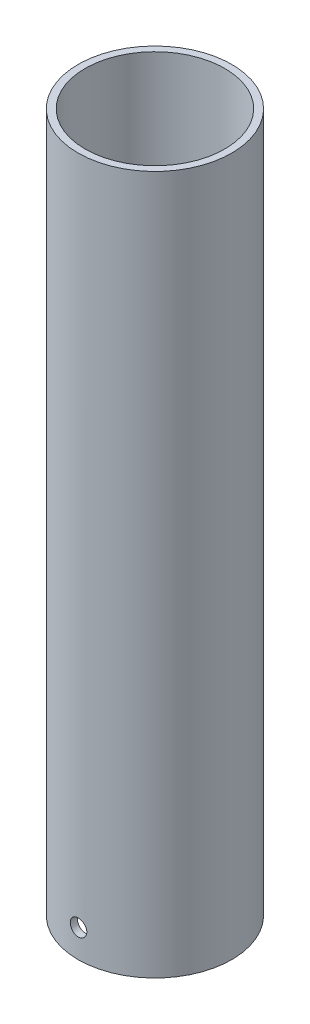
ISO-10303-21;
HEADER;
FILE_DESCRIPTION(('STEP AP214'),'2;1');
FILE_NAME('part.step','',(''),(''),'','','');
FILE_SCHEMA(('AUTOMOTIVE_DESIGN { 1 0 10303 214 1 1 1 1 }'));
ENDSEC;
DATA;
#1=APPLICATION_CONTEXT('core data for automotive mechanical design processes');
#2=APPLICATION_PROTOCOL_DEFINITION('international standard','automotive_design',2000,#1);
#3=PRODUCT_CONTEXT('',#1,'mechanical');
#4=PRODUCT('Part','Part','',(#3));
#5=PRODUCT_RELATED_PRODUCT_CATEGORY('part','',(#4));
#6=PRODUCT_DEFINITION_FORMATION('','',#4);
#7=PRODUCT_DEFINITION_CONTEXT('part definition',#1,'design');
#8=PRODUCT_DEFINITION('design','',#6,#7);
#9=PRODUCT_DEFINITION_SHAPE('','',#8);
#10=(LENGTH_UNIT() NAMED_UNIT(*) SI_UNIT(.MILLI.,.METRE.));
#11=(NAMED_UNIT(*) PLANE_ANGLE_UNIT() SI_UNIT($,.RADIAN.));
#12=(NAMED_UNIT(*) SI_UNIT($,.STERADIAN.) SOLID_ANGLE_UNIT());
#13=UNCERTAINTY_MEASURE_WITH_UNIT(LENGTH_MEASURE(1.E-05),#10,'distance_accuracy_value','');
#14=(GEOMETRIC_REPRESENTATION_CONTEXT(3) GLOBAL_UNCERTAINTY_ASSIGNED_CONTEXT((#13)) GLOBAL_UNIT_ASSIGNED_CONTEXT((#10,
#11,#12)) REPRESENTATION_CONTEXT('',''));
#15=CARTESIAN_POINT('',(0.,0.,0.));
#16=DIRECTION('',(0.,0.,1.));
#17=DIRECTION('',(1.,0.,0.));
#18=AXIS2_PLACEMENT_3D('',#15,#16,#17);
#19=CARTESIAN_POINT('',(0.,-500.,0.));
#20=DIRECTION('',(0.,1.,0.));
#21=DIRECTION('',(0.,0.,1.));
#22=AXIS2_PLACEMENT_3D('',#19,#20,#21);
#23=CYLINDRICAL_SURFACE('',#22,55.);
#24=CARTESIAN_POINT('',(0.,-485.9,55.));
#25=CARTESIAN_POINT('',(0.165251923815972,-485.900001696065,55.0000004926408));
#26=CARTESIAN_POINT('',(0.33047823093432,-485.893054655717,54.9992537367276));
#27=CARTESIAN_POINT('',(0.659804479086756,-485.865318537519,54.9962886281673));
#28=CARTESIAN_POINT('',(0.823904144690006,-485.84452618867,54.9940699277689));
#29=CARTESIAN_POINT('',(1.14987884905884,-485.789225601533,54.9882203773107));
#30=CARTESIAN_POINT('',(1.31175204257843,-485.754706621258,54.984588421334));
#31=CARTESIAN_POINT('',(1.63205457948574,-485.672191583186,54.9760136258339));
#32=CARTESIAN_POINT('',(1.79048263931581,-485.624190592022,54.9710703064905));
#33=CARTESIAN_POINT('',(2.1025546966715,-485.51512089148,54.9600183823701));
#34=CARTESIAN_POINT('',(2.25620329863431,-485.45406523537,54.9539109422467));
#35=CARTESIAN_POINT('',(2.55785693090068,-485.319273342346,54.9406968604664));
#36=CARTESIAN_POINT('',(2.70585985845128,-485.245532436029,54.9335898510474));
#37=CARTESIAN_POINT('',(2.99504401897061,-485.085958017382,54.9185821574634));
#38=CARTESIAN_POINT('',(3.13622906430226,-485.000131370705,54.9106819246382));
#39=CARTESIAN_POINT('',(3.41093470357817,-484.816927588087,54.8943026917391));
#40=CARTESIAN_POINT('',(3.544452437054,-484.719546182386,54.8858234782125));
#41=CARTESIAN_POINT('',(3.8032645099277,-484.5136036573,54.8684978757714));
#42=CARTESIAN_POINT('',(3.92853031801673,-484.405006774676,54.8596503695649));
#43=CARTESIAN_POINT('',(4.16952380011991,-484.177622164266,54.8418606478602));
#44=CARTESIAN_POINT('',(4.28524793086471,-484.058830683873,54.8329183985583));
#45=CARTESIAN_POINT('',(4.50625929142161,-483.811963479578,54.8151978683042));
#46=CARTESIAN_POINT('',(4.61154985544568,-483.683890744447,54.8064195357025));
#47=CARTESIAN_POINT('',(4.81103154241922,-483.419274733328,54.7892690647472));
#48=CARTESIAN_POINT('',(4.90521855556136,-483.282728349316,54.7808970774664));
#49=CARTESIAN_POINT('',(5.08196459826547,-483.001869709795,54.7647836804045));
#50=CARTESIAN_POINT('',(5.16449891203188,-482.857541818931,54.7570436252048));
#51=CARTESIAN_POINT('',(5.31714060360541,-482.562350529781,54.7424323236239));
#52=CARTESIAN_POINT('',(5.38724336475793,-482.411484729312,54.7355614002791));
#53=CARTESIAN_POINT('',(5.51445125574265,-482.1043822326,54.7228921541646));
#54=CARTESIAN_POINT('',(5.57156146931002,-481.948147664691,54.7170934120378));
#55=CARTESIAN_POINT('',(5.67241823407836,-481.631366333858,54.7067290417786));
#56=CARTESIAN_POINT('',(5.71615986826452,-481.47081800788,54.7021638674284));
#57=CARTESIAN_POINT('',(5.82645693690559,-480.98578475035,54.6905674420412));
#58=CARTESIAN_POINT('',(5.87271957058156,-480.656373580176,54.6855698533077));
#59=CARTESIAN_POINT('',(5.90931015438678,-479.994606873016,54.6816271290788));
#60=CARTESIAN_POINT('',(5.89963978284728,-479.662251424676,54.6826818119783));
#61=CARTESIAN_POINT('',(5.82488663349667,-479.005276148906,54.6906946583063));
#62=CARTESIAN_POINT('',(5.76003569448409,-478.68062978952,54.6976281218599));
#63=CARTESIAN_POINT('',(5.57710373909042,-478.04686819144,54.7165815111996));
#64=CARTESIAN_POINT('',(5.45902190641148,-477.737753191,54.7286015149876));
#65=CARTESIAN_POINT('',(5.17273112909581,-477.143084003696,54.7564012345136));
#66=CARTESIAN_POINT('',(5.00441986719734,-476.857579442024,54.7721886111024));
#67=CARTESIAN_POINT('',(4.62252000107564,-476.318783054902,54.8057381299016));
#68=CARTESIAN_POINT('',(4.40892987105285,-476.065492315447,54.8235003386499));
#69=CARTESIAN_POINT('',(3.94124313108592,-475.596965265478,54.859108177559));
#70=CARTESIAN_POINT('',(3.68694634668255,-475.381928716354,54.8769537733407));
#71=CARTESIAN_POINT('',(3.14575825416079,-474.99756465262,54.9106327193298));
#72=CARTESIAN_POINT('',(2.85886690060961,-474.828237201725,54.9264660667323));
#73=CARTESIAN_POINT('',(2.26049088569065,-474.540103668175,54.954342884671));
#74=CARTESIAN_POINT('',(1.94900099771093,-474.421308356843,54.9663855470505));
#75=CARTESIAN_POINT('',(1.31033803276483,-474.237760945678,54.9853161637654));
#76=CARTESIAN_POINT('',(0.983165496153702,-474.173006985228,54.9922042955675));
#77=CARTESIAN_POINT('',(0.324153679234895,-474.09963528852,55.0000268820587));
#78=CARTESIAN_POINT('',(-0.0076545921820972,-474.090742023393,55.0009905581983));
#79=CARTESIAN_POINT('',(-0.668036806137716,-474.128619575641,54.996934154655));
#80=CARTESIAN_POINT('',(-0.996610799004966,-474.175389525456,54.9919141682328));
#81=CARTESIAN_POINT('',(-1.64039743331984,-474.323037183129,54.9764730521853));
#82=CARTESIAN_POINT('',(-1.95564014468717,-474.423785245751,54.9660648660119));
#83=CARTESIAN_POINT('',(-2.56475193342887,-474.676395697931,54.941014321307));
#84=CARTESIAN_POINT('',(-2.85862046358909,-474.828259395572,54.9263718544185));
#85=CARTESIAN_POINT('',(-3.41788376599179,-475.17946877718,54.8944162354283));
#86=CARTESIAN_POINT('',(-3.68316474263062,-475.378994738182,54.8770930335597));
#87=CARTESIAN_POINT('',(-4.17656899471111,-475.819608464816,54.8417503145396));
#88=CARTESIAN_POINT('',(-4.40469119352489,-476.060697434267,54.8237307772315));
#89=CARTESIAN_POINT('',(-4.81826509203011,-476.578794480963,54.7889376472177));
#90=CARTESIAN_POINT('',(-5.00353546783884,-476.855947708161,54.7721695453092));
#91=CARTESIAN_POINT('',(-5.32489676059165,-477.437609643072,54.7418637464266));
#92=CARTESIAN_POINT('',(-5.46098843674121,-477.742117928396,54.7283259995843));
#93=CARTESIAN_POINT('',(-5.67983450106614,-478.369172203244,54.7060473210284));
#94=CARTESIAN_POINT('',(-5.76269524465273,-478.69168081718,54.6972968296044));
#95=CARTESIAN_POINT('',(-5.87304868084153,-479.346314261344,54.685560435615));
#96=CARTESIAN_POINT('',(-5.9005432232974,-479.678438769919,54.6825743404542));
#97=CARTESIAN_POINT('',(-5.8997163487702,-480.175369647343,54.6826588098542));
#98=CARTESIAN_POINT('',(-5.89248598669608,-480.340471969737,54.6834414198669));
#99=CARTESIAN_POINT('',(-5.86421583754713,-480.669459836055,54.6864811465573));
#100=CARTESIAN_POINT('',(-5.84318118124395,-480.833345809192,54.6887377153933));
#101=CARTESIAN_POINT('',(-5.7874403342461,-481.158799561572,54.6946643313782));
#102=CARTESIAN_POINT('',(-5.75272914303297,-481.320366470482,54.6983348955118));
#103=CARTESIAN_POINT('',(-5.66990757154475,-481.639932584327,54.706982025054));
#104=CARTESIAN_POINT('',(-5.62180208397009,-481.797933069275,54.7119581135393));
#105=CARTESIAN_POINT('',(-5.51252537576239,-482.109336056446,54.7230762768164));
#106=CARTESIAN_POINT('',(-5.45135191868914,-482.262737766508,54.7292185511681));
#107=CARTESIAN_POINT('',(-5.31640908813656,-482.563785091999,54.7424915976431));
#108=CARTESIAN_POINT('',(-5.24264430874209,-482.711432782797,54.7496220090557));
#109=CARTESIAN_POINT('',(-5.08300000902407,-483.000052963189,54.7646741791044));
#110=CARTESIAN_POINT('',(-4.99711616417456,-483.141023045878,54.7725962199271));
#111=CARTESIAN_POINT('',(-4.81389363696643,-483.415201987271,54.7890032877828));
#112=CARTESIAN_POINT('',(-4.71655910689096,-483.548413633325,54.7974881102543));
#113=CARTESIAN_POINT('',(-4.51054996658395,-483.806887781118,54.8148308069172));
#114=CARTESIAN_POINT('',(-4.40181832551174,-483.932104716691,54.8236904106697));
#115=CARTESIAN_POINT('',(-4.17424900525383,-484.172898006421,54.8414866928416));
#116=CARTESIAN_POINT('',(-4.05541502198889,-484.288477855894,54.850423342008));
#117=CARTESIAN_POINT('',(-3.80836367378882,-484.509305082647,54.8681301693788));
#118=CARTESIAN_POINT('',(-3.68014065671115,-484.614546145288,54.8769002432384));
#119=CARTESIAN_POINT('',(-3.41532206337729,-484.813837003028,54.8940176211671));
#120=CARTESIAN_POINT('',(-3.27872959659365,-484.907890916708,54.9023650801688));
#121=CARTESIAN_POINT('',(-2.99763164729147,-485.084470656935,54.918431173152));
#122=CARTESIAN_POINT('',(-2.85310202042774,-485.166958248623,54.9261476879342));
#123=CARTESIAN_POINT('',(-2.557613120907,-485.319421568178,54.9406997304938));
#124=CARTESIAN_POINT('',(-2.40665622923734,-485.389401880297,54.9475355808006));
#125=CARTESIAN_POINT('',(-2.09945502818866,-485.51632878573,54.9601300368283));
#126=CARTESIAN_POINT('',(-1.94321511265078,-485.573285918445,54.9658895129429));
#127=CARTESIAN_POINT('',(-1.62650076165339,-485.673808309576,54.9761730862795));
#128=CARTESIAN_POINT('',(-1.46602736556805,-485.717376822451,54.9806974836903));
#129=CARTESIAN_POINT('',(-1.09030889926869,-485.802515974921,54.989606573991));
#130=CARTESIAN_POINT('',(-0.873888135135636,-485.83903668697,54.9934884237775));
#131=CARTESIAN_POINT('',(-0.438296557663357,-485.887777515191,54.9986848038389));
#132=CARTESIAN_POINT('',(-0.219125757868508,-485.899997751,54.9999993467532));
#133=CARTESIAN_POINT('',(0.,-485.9,55.));
#134=B_SPLINE_CURVE_WITH_KNOTS('',3,(#24,#25,#26,#27,#28,#29,#30,#31,#32,#33,#34,#35,#36,#37,
#38,#39,#40,#41,#42,#43,#44,#45,#46,#47,#48,#49,#50,#51,#52,#53,#54,#55,#56,#57,#58,#59,#60,#61,
#62,#63,#64,#65,#66,#67,#68,#69,#70,#71,#72,#73,#74,#75,#76,#77,#78,#79,#80,#81,#82,#83,#84,#85,
#86,#87,#88,#89,#90,#91,#92,#93,#94,#95,#96,#97,#98,#99,#100,#101,#102,#103,#104,#105,#106,#107,
#108,#109,#110,#111,#112,#113,#114,#115,#116,#117,#118,#119,#120,#121,#122,#123,#124,#125,#126,
#127,#128,#129,#130,#131,#132,#133),.UNSPECIFIED.,.T.,.F.,(4,2,2,2,2,2,2,2,2,2,2,2,2,2,2,2,2,2,
2,2,2,2,2,2,2,2,2,2,2,2,2,2,2,2,2,2,2,2,2,2,2,2,2,2,2,2,2,2,2,2,2,2,2,2,4),(0.,
0.495564114495024,0.991245349171966,1.48731525260215,1.98356691599698,2.47932468206426,
2.97526532712235,3.47092536685804,3.96676913851035,4.46424593211075,4.96190663772064,
5.45940779157145,5.95709251342609,6.45581747465832,6.95472725922807,7.45344149290461,
7.95233893545496,8.94520183164471,9.93803493604739,10.9267171755196,11.9154145769883,
12.9061398621183,13.8968985378483,14.892688033057,15.8884789162896,16.8844819539824,
17.8804506984155,18.8715030156346,19.8625398866268,20.8512070752453,21.8398995664646,
22.8323925973491,23.8249143793324,24.821562085904,25.818194405881,26.8128292097761,
27.8074307811334,28.3027360900402,28.7978574083561,29.2931599249257,29.788281753037,
30.2834883838211,30.778514717628,31.2737181437487,31.7687425479874,32.2663743812832,
32.7638249341023,33.2615774509369,33.7591461478227,34.2583227248082,34.7573159633971,
35.2559039360102,35.754370617569,36.4114969872624,37.0686201217688),.UNSPECIFIED.);
#135=CARTESIAN_POINT('',(0.,-485.9,55.));
#136=VERTEX_POINT('',#135);
#137=EDGE_CURVE('E10',#136,#136,#134,.T.);
#138=ORIENTED_EDGE('',*,*,#137,.F.);
#139=EDGE_LOOP('',(#138));
#140=FACE_BOUND('',#139,.T.);
#141=CARTESIAN_POINT('',(0.,-500.,0.));
#142=DIRECTION('',(0.,1.,0.));
#143=DIRECTION('',(0.,0.,1.));
#144=AXIS2_PLACEMENT_3D('',#141,#142,#143);
#145=CIRCLE('',#144,55.);
#146=CARTESIAN_POINT('',(0.,-500.,55.));
#147=VERTEX_POINT('',#146);
#148=EDGE_CURVE('E44',#147,#147,#145,.T.);
#149=ORIENTED_EDGE('',*,*,#148,.T.);
#150=EDGE_LOOP('',(#149));
#151=FACE_BOUND('',#150,.T.);
#152=CARTESIAN_POINT('',(0.,0.,0.));
#153=DIRECTION('',(0.,1.,0.));
#154=DIRECTION('',(0.,0.,1.));
#155=AXIS2_PLACEMENT_3D('',#152,#153,#154);
#156=CIRCLE('',#155,55.);
#157=CARTESIAN_POINT('',(0.,0.,55.));
#158=VERTEX_POINT('',#157);
#159=EDGE_CURVE('E48',#158,#158,#156,.T.);
#160=ORIENTED_EDGE('',*,*,#159,.F.);
#161=EDGE_LOOP('',(#160));
#162=FACE_BOUND('',#161,.T.);
#163=ADVANCED_FACE('F34',(#140,#151,#162),#23,.T.);
#164=CARTESIAN_POINT('',(0.,-500.,0.));
#165=DIRECTION('',(0.,1.,0.));
#166=DIRECTION('',(0.,0.,1.));
#167=AXIS2_PLACEMENT_3D('',#164,#165,#166);
#168=PLANE('',#167);
#169=CARTESIAN_POINT('',(0.,-500.,0.));
#170=DIRECTION('',(0.,1.,0.));
#171=DIRECTION('',(0.,0.,1.));
#172=AXIS2_PLACEMENT_3D('',#169,#170,#171);
#173=CIRCLE('',#172,50.);
#174=CARTESIAN_POINT('',(0.,-500.,50.));
#175=VERTEX_POINT('',#174);
#176=EDGE_CURVE('E53',#175,#175,#173,.T.);
#177=ORIENTED_EDGE('',*,*,#176,.T.);
#178=EDGE_LOOP('',(#177));
#179=FACE_BOUND('',#178,.T.);
#180=ORIENTED_EDGE('',*,*,#148,.F.);
#181=EDGE_LOOP('',(#180));
#182=FACE_BOUND('',#181,.T.);
#183=ADVANCED_FACE('F79',(#179,#182),#168,.F.);
#184=CARTESIAN_POINT('',(0.,0.,0.));
#185=DIRECTION('',(0.,1.,0.));
#186=DIRECTION('',(0.,0.,1.));
#187=AXIS2_PLACEMENT_3D('',#184,#185,#186);
#188=PLANE('',#187);
#189=CARTESIAN_POINT('',(0.,0.,0.));
#190=DIRECTION('',(0.,1.,0.));
#191=DIRECTION('',(0.,0.,1.));
#192=AXIS2_PLACEMENT_3D('',#189,#190,#191);
#193=CIRCLE('',#192,50.);
#194=CARTESIAN_POINT('',(0.,0.,50.));
#195=VERTEX_POINT('',#194);
#196=EDGE_CURVE('E55',#195,#195,#193,.T.);
#197=ORIENTED_EDGE('',*,*,#196,.F.);
#198=EDGE_LOOP('',(#197));
#199=FACE_BOUND('',#198,.T.);
#200=ORIENTED_EDGE('',*,*,#159,.T.);
#201=EDGE_LOOP('',(#200));
#202=FACE_BOUND('',#201,.T.);
#203=ADVANCED_FACE('F75',(#199,#202),#188,.T.);
#204=CARTESIAN_POINT('',(0.,-500.,0.));
#205=DIRECTION('',(0.,1.,0.));
#206=DIRECTION('',(0.,0.,1.));
#207=AXIS2_PLACEMENT_3D('',#204,#205,#206);
#208=CYLINDRICAL_SURFACE('',#207,50.);
#209=CARTESIAN_POINT('',(0.,-485.9,50.));
#210=CARTESIAN_POINT('',(0.165145285581986,-485.900001811355,50.0000005754628));
#211=CARTESIAN_POINT('',(0.33026366803312,-485.893063676845,49.9991801874426));
#212=CARTESIAN_POINT('',(0.65937331590051,-485.865363881165,49.9959227858171));
#213=CARTESIAN_POINT('',(0.823364312528986,-485.844599031575,49.9934853993351));
#214=CARTESIAN_POINT('',(1.14911724716409,-485.789373485081,49.9870592908841));
#215=CARTESIAN_POINT('',(1.31087739280681,-485.75490237171,49.9830693890861));
#216=CARTESIAN_POINT('',(1.63095444440045,-485.672504396424,49.9736493718119));
#217=CARTESIAN_POINT('',(1.78927006655474,-485.624572607151,49.9682187289843));
#218=CARTESIAN_POINT('',(2.1011151440984,-485.515665403778,49.9560771300883));
#219=CARTESIAN_POINT('',(2.25464934365634,-485.454703423532,49.9493674934006));
#220=CARTESIAN_POINT('',(2.55608026926765,-485.320122820776,49.9348498815033));
#221=CARTESIAN_POINT('',(2.70397489458645,-485.24649953714,49.927041501996));
#222=CARTESIAN_POINT('',(2.99295438840265,-485.087183095532,49.9105516017614));
#223=CARTESIAN_POINT('',(3.13404299199186,-485.00149666127,49.9018705681961));
#224=CARTESIAN_POINT('',(3.40857070519793,-484.818595294166,49.8838709283505));
#225=CARTESIAN_POINT('',(3.54200695734625,-484.721376095917,49.8745520867185));
#226=CARTESIAN_POINT('',(3.80077105305428,-484.515701988143,49.855501615222));
#227=CARTESIAN_POINT('',(3.92606404617252,-484.407203370311,49.8457684729308));
#228=CARTESIAN_POINT('',(4.16712194255103,-484.180016235346,49.8261951906713));
#229=CARTESIAN_POINT('',(4.28288330542807,-484.061323965076,49.8163550124688));
#230=CARTESIAN_POINT('',(4.50398157896774,-483.814652514465,49.7968519713897));
#231=CARTESIAN_POINT('',(4.60932179702516,-483.686676303097,49.7871890530536));
#232=CARTESIAN_POINT('',(4.80891611334244,-483.422247291075,49.7683070015079));
#233=CARTESIAN_POINT('',(4.9031661071188,-483.285791380464,49.7590880333448));
#234=CARTESIAN_POINT('',(5.08009897707705,-483.005028791702,49.7413361785004));
#235=CARTESIAN_POINT('',(5.16275082511973,-482.860702436671,49.7328051572217));
#236=CARTESIAN_POINT('',(5.31562617721763,-482.565494703527,49.716697684174));
#237=CARTESIAN_POINT('',(5.38584506035761,-482.414610914075,49.7091215876186));
#238=CARTESIAN_POINT('',(5.51328045856821,-482.107453099113,49.6951492615471));
#239=CARTESIAN_POINT('',(5.57050211783806,-481.951181234465,49.688752565423));
#240=CARTESIAN_POINT('',(5.67157412574277,-481.634306426872,49.6773167022509));
#241=CARTESIAN_POINT('',(5.71541955995205,-481.473701915643,49.6722780342215));
#242=CARTESIAN_POINT('',(5.82595123920083,-480.988735669625,49.6594813975066));
#243=CARTESIAN_POINT('',(5.87237238922735,-480.659432847521,49.6539588960552));
#244=CARTESIAN_POINT('',(5.90930756979548,-479.997847406108,49.6495758727492));
#245=CARTESIAN_POINT('',(5.89982361234882,-479.665564894467,49.6507151111401));
#246=CARTESIAN_POINT('',(5.82550174562499,-479.009011130839,49.6594895282279));
#247=CARTESIAN_POINT('',(5.76094499968212,-478.684707780041,49.6670917109483));
#248=CARTESIAN_POINT('',(5.57872881083169,-478.051583000024,49.6878870170284));
#249=CARTESIAN_POINT('',(5.4610683994788,-477.742761853267,49.701080242351));
#250=CARTESIAN_POINT('',(5.17568531494602,-477.148474004874,49.7316078940902));
#251=CARTESIAN_POINT('',(5.00783965681982,-476.86306689744,49.7489524728188));
#252=CARTESIAN_POINT('',(4.6269372931981,-476.32436580936,49.7858207132511));
#253=CARTESIAN_POINT('',(4.41387874414613,-476.071073138854,49.8053444637951));
#254=CARTESIAN_POINT('',(3.94703659645635,-475.602156856558,49.8445180305151));
#255=CARTESIAN_POINT('',(3.69301043777887,-475.386774660252,49.8641678830803));
#256=CARTESIAN_POINT('',(3.15228113871992,-475.001670666714,49.901266929179));
#257=CARTESIAN_POINT('',(2.86557793627299,-474.83194895621,49.9187161185326));
#258=CARTESIAN_POINT('',(2.26745256274046,-474.542986436861,49.949456979023));
#259=CARTESIAN_POINT('',(1.95602344360066,-474.423759877342,49.9627474763343));
#260=CARTESIAN_POINT('',(1.31737428003723,-474.239359275451,49.9836625010356));
#261=CARTESIAN_POINT('',(0.990154894585969,-474.174182979468,49.9912872646551));
#262=CARTESIAN_POINT('',(0.331302141616504,-474.100043903541,49.9999811311526));
#263=CARTESIAN_POINT('',(-0.000293292507056126,-474.090748388168,50.0010890370282));
#264=CARTESIAN_POINT('',(-0.660317209085497,-474.127757913437,49.9967289079924));
#265=CARTESIAN_POINT('',(-0.988745751371958,-474.174061901564,49.9912609975633));
#266=CARTESIAN_POINT('',(-1.63213768192873,-474.320679695762,49.9743879550489));
#267=CARTESIAN_POINT('',(-1.94713752164598,-474.420835710858,49.9630001719073));
#268=CARTESIAN_POINT('',(-2.55586852191291,-474.672151106232,49.9355630640049));
#269=CARTESIAN_POINT('',(-2.84959903231808,-474.823312044791,49.9195135968245));
#270=CARTESIAN_POINT('',(-3.4089450709313,-475.17315717705,49.8844473886824));
#271=CARTESIAN_POINT('',(-3.67442448867547,-475.372057626556,49.8654172860774));
#272=CARTESIAN_POINT('',(-4.168349561552,-475.811429729694,49.8265628089239));
#273=CARTESIAN_POINT('',(-4.39679391136076,-476.051902847965,49.8067384064105));
#274=CARTESIAN_POINT('',(-4.81133754363732,-476.569051284624,49.7684106894132));
#275=CARTESIAN_POINT('',(-4.99721691411751,-476.845903475617,49.7499145602921));
#276=CARTESIAN_POINT('',(-5.31983553668801,-477.427105278668,49.7164537701436));
#277=CARTESIAN_POINT('',(-5.45657568214032,-477.7314543907,49.7014890449163));
#278=CARTESIAN_POINT('',(-5.67668069512125,-478.358225578592,49.6768315396878));
#279=CARTESIAN_POINT('',(-5.76017160463943,-478.680602997043,49.6671263185908));
#280=CARTESIAN_POINT('',(-5.87179231977705,-479.335104868347,49.6540567969546));
#281=CARTESIAN_POINT('',(-5.89992439909208,-479.667228920317,49.6506922359925));
#282=CARTESIAN_POINT('',(-5.90003748387925,-480.164057790536,49.6506735590206));
#283=CARTESIAN_POINT('',(-5.89313222591356,-480.329019330543,49.6514968561466));
#284=CARTESIAN_POINT('',(-5.86553612350295,-480.657752520054,49.6547653764949));
#285=CARTESIAN_POINT('',(-5.84485040873375,-480.821524589407,49.65720999619));
#286=CARTESIAN_POINT('',(-5.78982990672399,-481.14677771764,49.6636549523504));
#287=CARTESIAN_POINT('',(-5.75549014356106,-481.308257919054,49.6676558559581));
#288=CARTESIAN_POINT('',(-5.67343245444305,-481.627679453561,49.6770960348766));
#289=CARTESIAN_POINT('',(-5.62571940235343,-481.78562205332,49.6825347861261));
#290=CARTESIAN_POINT('',(-5.517252731582,-482.096925051706,49.6946968719445));
#291=CARTESIAN_POINT('',(-5.45649813078202,-482.250285104242,49.7014203032544));
#292=CARTESIAN_POINT('',(-5.32241330772308,-482.551284243858,49.715957796383));
#293=CARTESIAN_POINT('',(-5.24908765939982,-482.698925387874,49.7237714613319));
#294=CARTESIAN_POINT('',(-5.09033901868098,-482.987572301594,49.7402735807314));
#295=CARTESIAN_POINT('',(-5.00491164117272,-483.128575641279,49.7489623519491));
#296=CARTESIAN_POINT('',(-4.82261535114894,-483.402864721956,49.7669645804822));
#297=CARTESIAN_POINT('',(-4.72575056751741,-483.536153222255,49.7762778118469));
#298=CARTESIAN_POINT('',(-4.52058479327316,-483.794964255419,49.7953310069662));
#299=CARTESIAN_POINT('',(-4.41221548337283,-483.920432465421,49.8050732929973));
#300=CARTESIAN_POINT('',(-4.18535203685218,-484.161759857124,49.8246503477989));
#301=CARTESIAN_POINT('',(-4.06686159251552,-484.277622512882,49.8344850816882));
#302=CARTESIAN_POINT('',(-3.82047420659811,-484.499047356822,49.8539793161485));
#303=CARTESIAN_POINT('',(-3.69257161650767,-484.604603269742,49.8636387070844));
#304=CARTESIAN_POINT('',(-3.42836494214264,-484.804555169314,49.8825003787661));
#305=CARTESIAN_POINT('',(-3.2920639785216,-484.898955263632,49.8917028270338));
#306=CARTESIAN_POINT('',(-3.01143831513227,-485.076307099891,49.909428725075));
#307=CARTESIAN_POINT('',(-2.86708519927364,-485.159214159287,49.9179494731178));
#308=CARTESIAN_POINT('',(-2.57190394848415,-485.312528630402,49.9340279587555));
#309=CARTESIAN_POINT('',(-2.42107821310481,-485.382940625464,49.9415860491766));
#310=CARTESIAN_POINT('',(-2.1140894386824,-485.51073893628,49.9555222901092));
#311=CARTESIAN_POINT('',(-1.95793073998777,-485.568135567269,49.9619013742867));
#312=CARTESIAN_POINT('',(-1.6413316413727,-485.669538138047,49.9733041856378));
#313=CARTESIAN_POINT('',(-1.48089227404425,-485.713547275993,49.9783282364844));
#314=CARTESIAN_POINT('',(-1.1028425830938,-485.800242820176,49.9883021408589));
#315=CARTESIAN_POINT('',(-0.883976519079813,-485.837614038413,49.9926707788459));
#316=CARTESIAN_POINT('',(-0.44339080077265,-485.887491334171,49.9985193130828));
#317=CARTESIAN_POINT('',(-0.221671164501883,-485.899997568655,49.999999227568));
#318=CARTESIAN_POINT('',(0.,-485.9,50.));
#319=B_SPLINE_CURVE_WITH_KNOTS('',3,(#209,#210,#211,#212,#213,#214,#215,#216,#217,#218,#219,
#220,#221,#222,#223,#224,#225,#226,#227,#228,#229,#230,#231,#232,#233,#234,#235,#236,#237,#238,
#239,#240,#241,#242,#243,#244,#245,#246,#247,#248,#249,#250,#251,#252,#253,#254,#255,#256,#257,
#258,#259,#260,#261,#262,#263,#264,#265,#266,#267,#268,#269,#270,#271,#272,#273,#274,#275,#276,
#277,#278,#279,#280,#281,#282,#283,#284,#285,#286,#287,#288,#289,#290,#291,#292,#293,#294,#295,
#296,#297,#298,#299,#300,#301,#302,#303,#304,#305,#306,#307,#308,#309,#310,#311,#312,#313,#314,
#315,#316,#317,#318),.UNSPECIFIED.,.T.,.F.,(4,2,2,2,2,2,2,2,2,2,2,2,2,2,2,2,2,2,2,2,2,2,2,2,2,2,
2,2,2,2,2,2,2,2,2,2,2,2,2,2,2,2,2,2,2,2,2,2,2,2,2,2,2,2,4),(0.,0.49524191510275,
0.990598071760087,1.48633141021718,1.98224645182623,2.47765266053379,2.97324163980163,
3.46855547530862,3.96405307778614,4.46154788251536,4.95922664849152,5.45674695427307,
5.95445081661756,6.4534617711145,6.95265780367269,7.45165591273336,7.95083713354459,
8.94346249981509,9.93605214194921,10.9236044316841,11.9111747320225,12.9011853088552,
13.8912362611466,14.8873801682967,15.8835259675135,16.8799526840981,17.8763378528865,
18.8667842418634,19.857211881687,20.8447531748612,21.8323246417073,22.8244570788352,
23.8166244766781,24.813807730156,25.8109728537042,26.8057688211209,27.8005239294657,
28.2953665009935,28.7900249737908,29.2848638796246,29.7795226764891,30.2742187376343,
30.7687351857113,31.2634312844533,31.7579493416263,32.2555884661918,32.7530468164714,
33.2508061800349,33.7483816895406,34.2478404460121,34.7471156144893,35.245993692126,
35.7447524983421,36.4095098642915,37.0742630338663),.UNSPECIFIED.);
#320=CARTESIAN_POINT('',(0.,-485.9,50.));
#321=VERTEX_POINT('',#320);
#322=EDGE_CURVE('E58',#321,#321,#319,.T.);
#323=ORIENTED_EDGE('',*,*,#322,.T.);
#324=EDGE_LOOP('',(#323));
#325=FACE_BOUND('',#324,.T.);
#326=ORIENTED_EDGE('',*,*,#176,.F.);
#327=EDGE_LOOP('',(#326));
#328=FACE_BOUND('',#327,.T.);
#329=ORIENTED_EDGE('',*,*,#196,.T.);
#330=EDGE_LOOP('',(#329));
#331=FACE_BOUND('',#330,.T.);
#332=ADVANCED_FACE('F65',(#325,#328,#331),#208,.F.);
#333=CARTESIAN_POINT('',(0.,-480.,55.));
#334=DIRECTION('',(0.,0.,1.));
#335=DIRECTION('',(1.,0.,0.));
#336=AXIS2_PLACEMENT_3D('',#333,#334,#335);
#337=CYLINDRICAL_SURFACE('',#336,5.89999999999998);
#338=ORIENTED_EDGE('',*,*,#137,.T.);
#339=EDGE_LOOP('',(#338));
#340=FACE_BOUND('',#339,.T.);
#341=ORIENTED_EDGE('',*,*,#322,.F.);
#342=EDGE_LOOP('',(#341));
#343=FACE_BOUND('',#342,.T.);
#344=ADVANCED_FACE('F68',(#340,#343),#337,.F.);
#345=CLOSED_SHELL('',(#163,#183,#203,#332,#344));
#346=MANIFOLD_SOLID_BREP('B2',#345);
#347=ADVANCED_BREP_SHAPE_REPRESENTATION('',(#18,#346),#14);
#348=SHAPE_DEFINITION_REPRESENTATION(#9,#347);
ENDSEC;
END-ISO-10303-21;
